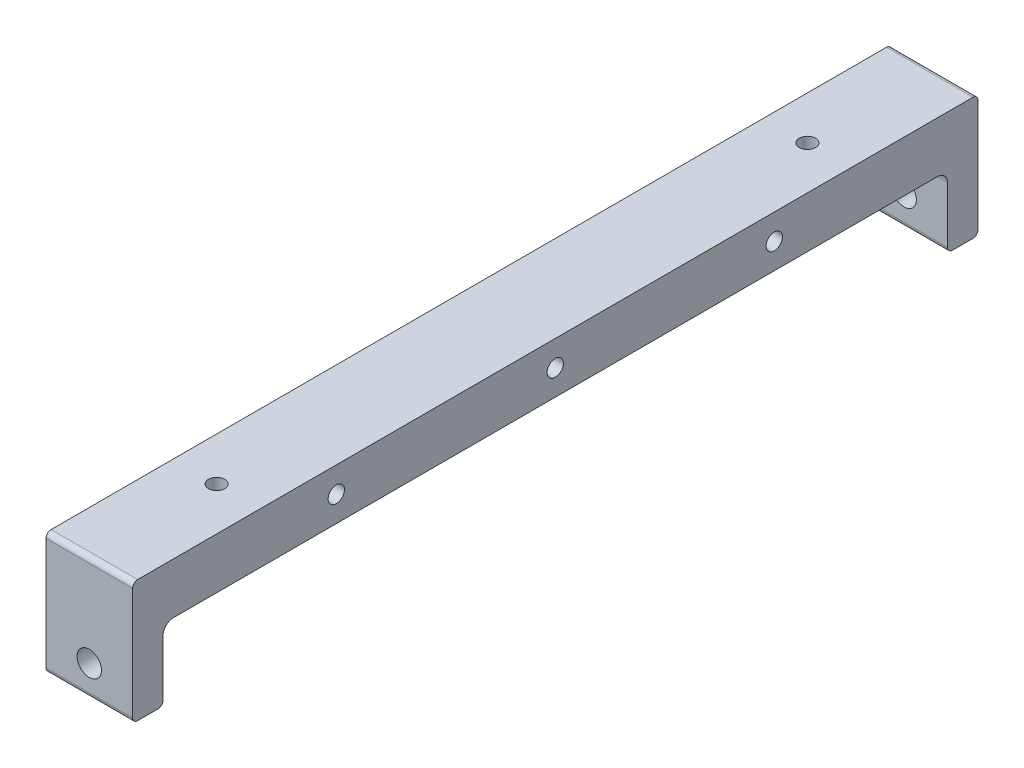
ISO-10303-21;
HEADER;
FILE_DESCRIPTION(('STEP AP214'),'2;1');
FILE_NAME('part.step','',(''),(''),'','','');
FILE_SCHEMA(('AUTOMOTIVE_DESIGN { 1 0 10303 214 1 1 1 1 }'));
ENDSEC;
DATA;
#1=APPLICATION_CONTEXT('core data for automotive mechanical design processes');
#2=APPLICATION_PROTOCOL_DEFINITION('international standard','automotive_design',2000,#1);
#3=PRODUCT_CONTEXT('',#1,'mechanical');
#4=PRODUCT('Part','Part','',(#3));
#5=PRODUCT_RELATED_PRODUCT_CATEGORY('part','',(#4));
#6=PRODUCT_DEFINITION_FORMATION('','',#4);
#7=PRODUCT_DEFINITION_CONTEXT('part definition',#1,'design');
#8=PRODUCT_DEFINITION('design','',#6,#7);
#9=PRODUCT_DEFINITION_SHAPE('','',#8);
#10=(LENGTH_UNIT() NAMED_UNIT(*) SI_UNIT(.MILLI.,.METRE.));
#11=(NAMED_UNIT(*) PLANE_ANGLE_UNIT() SI_UNIT($,.RADIAN.));
#12=(NAMED_UNIT(*) SI_UNIT($,.STERADIAN.) SOLID_ANGLE_UNIT());
#13=UNCERTAINTY_MEASURE_WITH_UNIT(LENGTH_MEASURE(1.E-05),#10,'distance_accuracy_value','');
#14=(GEOMETRIC_REPRESENTATION_CONTEXT(3) GLOBAL_UNCERTAINTY_ASSIGNED_CONTEXT((#13)) GLOBAL_UNIT_ASSIGNED_CONTEXT((#10,
#11,#12)) REPRESENTATION_CONTEXT('',''));
#15=CARTESIAN_POINT('',(0.,0.,0.));
#16=DIRECTION('',(0.,0.,1.));
#17=DIRECTION('',(1.,0.,0.));
#18=AXIS2_PLACEMENT_3D('',#15,#16,#17);
#19=CARTESIAN_POINT('',(-4.25,-6.,41.5));
#20=DIRECTION('',(0.,1.,0.));
#21=DIRECTION('',(0.,0.,1.));
#22=AXIS2_PLACEMENT_3D('',#19,#20,#21);
#23=PLANE('',#22);
#24=DIRECTION('',(0.,0.,-1.));
#25=VECTOR('',#24,1.);
#26=CARTESIAN_POINT('',(-4.25,-6.,41.5));
#27=LINE('',#26,#25);
#28=CARTESIAN_POINT('',(-4.25,-6.,41.));
#29=VERTEX_POINT('',#28);
#30=CARTESIAN_POINT('',(-4.25,-6.,39.));
#31=VERTEX_POINT('',#30);
#32=EDGE_CURVE('E272',#29,#31,#27,.T.);
#33=ORIENTED_EDGE('',*,*,#32,.T.);
#34=DIRECTION('',(1.,0.,0.));
#35=VECTOR('',#34,1.);
#36=CARTESIAN_POINT('',(-4.25,-6.,39.));
#37=LINE('',#36,#35);
#38=CARTESIAN_POINT('',(4.25,-6.,39.));
#39=VERTEX_POINT('',#38);
#40=EDGE_CURVE('E281',#31,#39,#37,.T.);
#41=ORIENTED_EDGE('',*,*,#40,.T.);
#42=DIRECTION('',(0.,0.,-1.));
#43=VECTOR('',#42,1.);
#44=CARTESIAN_POINT('',(4.25,-6.,41.5));
#45=LINE('',#44,#43);
#46=CARTESIAN_POINT('',(4.25,-6.,41.));
#47=VERTEX_POINT('',#46);
#48=EDGE_CURVE('E269',#47,#39,#45,.T.);
#49=ORIENTED_EDGE('',*,*,#48,.F.);
#50=DIRECTION('',(1.,0.,0.));
#51=VECTOR('',#50,1.);
#52=CARTESIAN_POINT('',(-4.25,-6.,41.));
#53=LINE('',#52,#51);
#54=EDGE_CURVE('E279',#47,#29,#53,.F.);
#55=ORIENTED_EDGE('',*,*,#54,.T.);
#56=EDGE_LOOP('',(#33,#41,#49,#55));
#57=FACE_BOUND('',#56,.T.);
#58=ADVANCED_FACE('F33',(#57),#23,.F.);
#59=CARTESIAN_POINT('',(4.25,-6.,41.5));
#60=DIRECTION('',(-1.,0.,0.));
#61=DIRECTION('',(0.,0.,1.));
#62=AXIS2_PLACEMENT_3D('',#59,#60,#61);
#63=PLANE('',#62);
#64=CARTESIAN_POINT('',(4.25,3.5,0.));
#65=DIRECTION('',(1.,0.,0.));
#66=DIRECTION('',(0.,0.,-1.));
#67=AXIS2_PLACEMENT_3D('',#64,#65,#66);
#68=CIRCLE('',#67,0.799999999999999);
#69=CARTESIAN_POINT('',(4.25,3.5,-0.799999999999999));
#70=VERTEX_POINT('',#69);
#71=EDGE_CURVE('E200',#70,#70,#68,.T.);
#72=ORIENTED_EDGE('',*,*,#71,.F.);
#73=EDGE_LOOP('',(#72));
#74=FACE_BOUND('',#73,.T.);
#75=CARTESIAN_POINT('',(4.25,3.5,-21.5));
#76=DIRECTION('',(1.,0.,0.));
#77=DIRECTION('',(0.,0.,-1.));
#78=AXIS2_PLACEMENT_3D('',#75,#76,#77);
#79=CIRCLE('',#78,0.799999999999999);
#80=CARTESIAN_POINT('',(4.25,3.5,-22.3));
#81=VERTEX_POINT('',#80);
#82=EDGE_CURVE('E206',#81,#81,#79,.T.);
#83=ORIENTED_EDGE('',*,*,#82,.F.);
#84=EDGE_LOOP('',(#83));
#85=FACE_BOUND('',#84,.T.);
#86=CARTESIAN_POINT('',(4.25,3.5,21.5));
#87=DIRECTION('',(1.,0.,0.));
#88=DIRECTION('',(0.,0.,-1.));
#89=AXIS2_PLACEMENT_3D('',#86,#87,#88);
#90=CIRCLE('',#89,0.799999999999999);
#91=CARTESIAN_POINT('',(4.25,3.5,20.7));
#92=VERTEX_POINT('',#91);
#93=EDGE_CURVE('E212',#92,#92,#90,.T.);
#94=ORIENTED_EDGE('',*,*,#93,.F.);
#95=EDGE_LOOP('',(#94));
#96=FACE_BOUND('',#95,.T.);
#97=ORIENTED_EDGE('',*,*,#48,.T.);
#98=CARTESIAN_POINT('',(4.25,-5.5,39.));
#99=DIRECTION('',(-1.,0.,0.));
#100=DIRECTION('',(0.,0.,1.));
#101=AXIS2_PLACEMENT_3D('',#98,#99,#100);
#102=CIRCLE('',#101,0.5);
#103=CARTESIAN_POINT('',(4.25,-5.5,38.5));
#104=VERTEX_POINT('',#103);
#105=EDGE_CURVE('E294',#39,#104,#102,.F.);
#106=ORIENTED_EDGE('',*,*,#105,.T.);
#107=DIRECTION('',(0.,-1.,0.));
#108=VECTOR('',#107,1.);
#109=CARTESIAN_POINT('',(4.25,-6.00000000000001,38.5));
#110=LINE('',#109,#108);
#111=CARTESIAN_POINT('',(4.25,0.,38.5));
#112=VERTEX_POINT('',#111);
#113=EDGE_CURVE('E222',#112,#104,#110,.T.);
#114=ORIENTED_EDGE('',*,*,#113,.F.);
#115=CARTESIAN_POINT('',(4.25,0.,37.5));
#116=DIRECTION('',(1.,0.,0.));
#117=DIRECTION('',(0.,0.,-1.));
#118=AXIS2_PLACEMENT_3D('',#115,#116,#117);
#119=CIRCLE('',#118,1.);
#120=CARTESIAN_POINT('',(4.25,1.,37.5));
#121=VERTEX_POINT('',#120);
#122=EDGE_CURVE('E242',#121,#112,#119,.T.);
#123=ORIENTED_EDGE('',*,*,#122,.F.);
#124=DIRECTION('',(0.,0.,1.));
#125=VECTOR('',#124,1.);
#126=CARTESIAN_POINT('',(4.25,1.,37.5));
#127=LINE('',#126,#125);
#128=CARTESIAN_POINT('',(4.25,1.,-37.5));
#129=VERTEX_POINT('',#128);
#130=EDGE_CURVE('E239',#129,#121,#127,.T.);
#131=ORIENTED_EDGE('',*,*,#130,.F.);
#132=CARTESIAN_POINT('',(4.25,0.,-37.5));
#133=DIRECTION('',(1.,0.,0.));
#134=DIRECTION('',(0.,0.,1.));
#135=AXIS2_PLACEMENT_3D('',#132,#133,#134);
#136=CIRCLE('',#135,1.);
#137=CARTESIAN_POINT('',(4.25,0.,-38.5));
#138=VERTEX_POINT('',#137);
#139=EDGE_CURVE('E236',#138,#129,#136,.T.);
#140=ORIENTED_EDGE('',*,*,#139,.F.);
#141=DIRECTION('',(0.,1.,0.));
#142=VECTOR('',#141,1.);
#143=CARTESIAN_POINT('',(4.25,0.,-38.5));
#144=LINE('',#143,#142);
#145=CARTESIAN_POINT('',(4.25,-5.5,-38.5));
#146=VERTEX_POINT('',#145);
#147=EDGE_CURVE('E218',#146,#138,#144,.T.);
#148=ORIENTED_EDGE('',*,*,#147,.F.);
#149=CARTESIAN_POINT('',(4.25,-5.5,-39.));
#150=DIRECTION('',(-1.,0.,0.));
#151=DIRECTION('',(0.,0.,1.));
#152=AXIS2_PLACEMENT_3D('',#149,#150,#151);
#153=CIRCLE('',#152,0.5);
#154=CARTESIAN_POINT('',(4.25,-6.,-39.));
#155=VERTEX_POINT('',#154);
#156=EDGE_CURVE('E290',#146,#155,#153,.F.);
#157=ORIENTED_EDGE('',*,*,#156,.T.);
#158=CARTESIAN_POINT('',(4.25,-6.,-41.));
#159=VERTEX_POINT('',#158);
#160=EDGE_CURVE('E263',#155,#159,#45,.T.);
#161=ORIENTED_EDGE('',*,*,#160,.T.);
#162=CARTESIAN_POINT('',(4.25,-5.5,-41.));
#163=DIRECTION('',(-1.,0.,0.));
#164=DIRECTION('',(0.,0.,1.));
#165=AXIS2_PLACEMENT_3D('',#162,#163,#164);
#166=CIRCLE('',#165,0.5);
#167=CARTESIAN_POINT('',(4.25,-5.5,-41.5));
#168=VERTEX_POINT('',#167);
#169=EDGE_CURVE('E288',#159,#168,#166,.F.);
#170=ORIENTED_EDGE('',*,*,#169,.T.);
#171=DIRECTION('',(0.,1.,0.));
#172=VECTOR('',#171,1.);
#173=CARTESIAN_POINT('',(4.25,-6.,-41.5));
#174=LINE('',#173,#172);
#175=CARTESIAN_POINT('',(4.25,5.5,-41.5));
#176=VERTEX_POINT('',#175);
#177=EDGE_CURVE('E249',#168,#176,#174,.T.);
#178=ORIENTED_EDGE('',*,*,#177,.T.);
#179=CARTESIAN_POINT('',(4.25,5.5,-41.));
#180=DIRECTION('',(-1.,0.,0.));
#181=DIRECTION('',(0.,0.,1.));
#182=AXIS2_PLACEMENT_3D('',#179,#180,#181);
#183=CIRCLE('',#182,0.5);
#184=CARTESIAN_POINT('',(4.25,6.,-41.));
#185=VERTEX_POINT('',#184);
#186=EDGE_CURVE('E284',#176,#185,#183,.F.);
#187=ORIENTED_EDGE('',*,*,#186,.T.);
#188=DIRECTION('',(0.,0.,-1.));
#189=VECTOR('',#188,1.);
#190=CARTESIAN_POINT('',(4.25,6.,41.5));
#191=LINE('',#190,#189);
#192=CARTESIAN_POINT('',(4.25,6.,41.));
#193=VERTEX_POINT('',#192);
#194=EDGE_CURVE('E276',#193,#185,#191,.T.);
#195=ORIENTED_EDGE('',*,*,#194,.F.);
#196=CARTESIAN_POINT('',(4.25,5.5,41.));
#197=DIRECTION('',(-1.,0.,0.));
#198=DIRECTION('',(0.,0.,1.));
#199=AXIS2_PLACEMENT_3D('',#196,#197,#198);
#200=CIRCLE('',#199,0.5);
#201=CARTESIAN_POINT('',(4.25,5.5,41.5));
#202=VERTEX_POINT('',#201);
#203=EDGE_CURVE('E286',#193,#202,#200,.F.);
#204=ORIENTED_EDGE('',*,*,#203,.T.);
#205=DIRECTION('',(0.,1.,0.));
#206=VECTOR('',#205,1.);
#207=CARTESIAN_POINT('',(4.25,-6.,41.5));
#208=LINE('',#207,#206);
#209=CARTESIAN_POINT('',(4.25,-5.5,41.5));
#210=VERTEX_POINT('',#209);
#211=EDGE_CURVE('E256',#210,#202,#208,.T.);
#212=ORIENTED_EDGE('',*,*,#211,.F.);
#213=CARTESIAN_POINT('',(4.25,-5.5,41.));
#214=DIRECTION('',(-1.,0.,0.));
#215=DIRECTION('',(0.,0.,1.));
#216=AXIS2_PLACEMENT_3D('',#213,#214,#215);
#217=CIRCLE('',#216,0.5);
#218=EDGE_CURVE('E292',#210,#47,#217,.F.);
#219=ORIENTED_EDGE('',*,*,#218,.T.);
#220=EDGE_LOOP('',(#97,#106,#114,#123,#131,#140,#148,#157,#161,#170,#178,#187,#195,#204,#212,#219));
#221=FACE_BOUND('',#220,.T.);
#222=ADVANCED_FACE('F348',(#74,#85,#96,#221),#63,.F.);
#223=CARTESIAN_POINT('',(-4.25,6.,41.5));
#224=DIRECTION('',(0.,-1.,0.));
#225=DIRECTION('',(0.,0.,-1.));
#226=AXIS2_PLACEMENT_3D('',#223,#224,#225);
#227=PLANE('',#226);
#228=CARTESIAN_POINT('',(0.,6.,-29.));
#229=DIRECTION('',(0.,1.,0.));
#230=DIRECTION('',(0.,0.,1.));
#231=AXIS2_PLACEMENT_3D('',#228,#229,#230);
#232=CIRCLE('',#231,0.799999999999998);
#233=CARTESIAN_POINT('',(0.,6.,-28.2));
#234=VERTEX_POINT('',#233);
#235=EDGE_CURVE('E182',#234,#234,#232,.T.);
#236=ORIENTED_EDGE('',*,*,#235,.F.);
#237=EDGE_LOOP('',(#236));
#238=FACE_BOUND('',#237,.T.);
#239=CARTESIAN_POINT('',(0.,6.,29.));
#240=DIRECTION('',(0.,1.,0.));
#241=DIRECTION('',(0.,0.,1.));
#242=AXIS2_PLACEMENT_3D('',#239,#240,#241);
#243=CIRCLE('',#242,0.799999999999998);
#244=CARTESIAN_POINT('',(0.,6.,29.8));
#245=VERTEX_POINT('',#244);
#246=EDGE_CURVE('E188',#245,#245,#243,.T.);
#247=ORIENTED_EDGE('',*,*,#246,.F.);
#248=EDGE_LOOP('',(#247));
#249=FACE_BOUND('',#248,.T.);
#250=DIRECTION('',(0.,0.,-1.));
#251=VECTOR('',#250,1.);
#252=CARTESIAN_POINT('',(-4.25,6.,41.5));
#253=LINE('',#252,#251);
#254=CARTESIAN_POINT('',(-4.25,6.,41.));
#255=VERTEX_POINT('',#254);
#256=CARTESIAN_POINT('',(-4.25,6.,-41.));
#257=VERTEX_POINT('',#256);
#258=EDGE_CURVE('E273',#255,#257,#253,.T.);
#259=ORIENTED_EDGE('',*,*,#258,.F.);
#260=DIRECTION('',(-1.,0.,0.));
#261=VECTOR('',#260,1.);
#262=CARTESIAN_POINT('',(-4.25,6.,41.));
#263=LINE('',#262,#261);
#264=EDGE_CURVE('E11',#255,#193,#263,.F.);
#265=ORIENTED_EDGE('',*,*,#264,.T.);
#266=ORIENTED_EDGE('',*,*,#194,.T.);
#267=DIRECTION('',(-1.,0.,0.));
#268=VECTOR('',#267,1.);
#269=CARTESIAN_POINT('',(-4.25,6.,-41.));
#270=LINE('',#269,#268);
#271=EDGE_CURVE('E42',#185,#257,#270,.T.);
#272=ORIENTED_EDGE('',*,*,#271,.T.);
#273=EDGE_LOOP('',(#259,#265,#266,#272));
#274=FACE_BOUND('',#273,.T.);
#275=ADVANCED_FACE('F330',(#238,#249,#274),#227,.F.);
#276=CARTESIAN_POINT('',(-4.25,-6.,41.5));
#277=DIRECTION('',(1.,0.,0.));
#278=DIRECTION('',(0.,0.,-1.));
#279=AXIS2_PLACEMENT_3D('',#276,#277,#278);
#280=PLANE('',#279);
#281=CARTESIAN_POINT('',(-4.25,3.5,-35.5));
#282=DIRECTION('',(-1.,0.,0.));
#283=DIRECTION('',(0.,0.,1.));
#284=AXIS2_PLACEMENT_3D('',#281,#282,#283);
#285=CIRCLE('',#284,0.799999999999999);
#286=CARTESIAN_POINT('',(-4.25,3.5,-34.7));
#287=VERTEX_POINT('',#286);
#288=EDGE_CURVE('E171',#287,#287,#285,.T.);
#289=ORIENTED_EDGE('',*,*,#288,.F.);
#290=EDGE_LOOP('',(#289));
#291=FACE_BOUND('',#290,.T.);
#292=CARTESIAN_POINT('',(-4.25,3.5,35.5));
#293=DIRECTION('',(-1.,0.,0.));
#294=DIRECTION('',(0.,0.,1.));
#295=AXIS2_PLACEMENT_3D('',#292,#293,#294);
#296=CIRCLE('',#295,0.799999999999999);
#297=CARTESIAN_POINT('',(-4.25,3.5,36.3));
#298=VERTEX_POINT('',#297);
#299=EDGE_CURVE('E170',#298,#298,#296,.T.);
#300=ORIENTED_EDGE('',*,*,#299,.F.);
#301=EDGE_LOOP('',(#300));
#302=FACE_BOUND('',#301,.T.);
#303=DIRECTION('',(0.,-1.,0.));
#304=VECTOR('',#303,1.);
#305=CARTESIAN_POINT('',(-4.25,-6.00000000000001,38.5));
#306=LINE('',#305,#304);
#307=CARTESIAN_POINT('',(-4.25,0.,38.5));
#308=VERTEX_POINT('',#307);
#309=CARTESIAN_POINT('',(-4.25,-5.5,38.5));
#310=VERTEX_POINT('',#309);
#311=EDGE_CURVE('E231',#308,#310,#306,.T.);
#312=ORIENTED_EDGE('',*,*,#311,.T.);
#313=CARTESIAN_POINT('',(-4.25,-5.5,39.));
#314=DIRECTION('',(1.,0.,0.));
#315=DIRECTION('',(0.,0.,-1.));
#316=AXIS2_PLACEMENT_3D('',#313,#314,#315);
#317=CIRCLE('',#316,0.5);
#318=EDGE_CURVE('E306',#310,#31,#317,.F.);
#319=ORIENTED_EDGE('',*,*,#318,.T.);
#320=ORIENTED_EDGE('',*,*,#32,.F.);
#321=CARTESIAN_POINT('',(-4.25,-5.5,41.));
#322=DIRECTION('',(1.,0.,0.));
#323=DIRECTION('',(0.,0.,-1.));
#324=AXIS2_PLACEMENT_3D('',#321,#322,#323);
#325=CIRCLE('',#324,0.5);
#326=CARTESIAN_POINT('',(-4.25,-5.5,41.5));
#327=VERTEX_POINT('',#326);
#328=EDGE_CURVE('E304',#29,#327,#325,.F.);
#329=ORIENTED_EDGE('',*,*,#328,.T.);
#330=DIRECTION('',(0.,-1.,0.));
#331=VECTOR('',#330,1.);
#332=CARTESIAN_POINT('',(-4.25,-6.,41.5));
#333=LINE('',#332,#331);
#334=CARTESIAN_POINT('',(-4.25,5.5,41.5));
#335=VERTEX_POINT('',#334);
#336=EDGE_CURVE('E259',#335,#327,#333,.T.);
#337=ORIENTED_EDGE('',*,*,#336,.F.);
#338=CARTESIAN_POINT('',(-4.25,5.5,41.));
#339=DIRECTION('',(1.,0.,0.));
#340=DIRECTION('',(0.,0.,-1.));
#341=AXIS2_PLACEMENT_3D('',#338,#339,#340);
#342=CIRCLE('',#341,0.5);
#343=EDGE_CURVE('E300',#335,#255,#342,.F.);
#344=ORIENTED_EDGE('',*,*,#343,.T.);
#345=ORIENTED_EDGE('',*,*,#258,.T.);
#346=CARTESIAN_POINT('',(-4.25,5.5,-41.));
#347=DIRECTION('',(1.,0.,0.));
#348=DIRECTION('',(0.,0.,-1.));
#349=AXIS2_PLACEMENT_3D('',#346,#347,#348);
#350=CIRCLE('',#349,0.5);
#351=CARTESIAN_POINT('',(-4.25,5.5,-41.5));
#352=VERTEX_POINT('',#351);
#353=EDGE_CURVE('E298',#257,#352,#350,.F.);
#354=ORIENTED_EDGE('',*,*,#353,.T.);
#355=DIRECTION('',(0.,-1.,0.));
#356=VECTOR('',#355,1.);
#357=CARTESIAN_POINT('',(-4.25,-6.,-41.5));
#358=LINE('',#357,#356);
#359=CARTESIAN_POINT('',(-4.25,-5.5,-41.5));
#360=VERTEX_POINT('',#359);
#361=EDGE_CURVE('E260',#352,#360,#358,.T.);
#362=ORIENTED_EDGE('',*,*,#361,.T.);
#363=CARTESIAN_POINT('',(-4.25,-5.5,-41.));
#364=DIRECTION('',(1.,0.,0.));
#365=DIRECTION('',(0.,0.,-1.));
#366=AXIS2_PLACEMENT_3D('',#363,#364,#365);
#367=CIRCLE('',#366,0.5);
#368=CARTESIAN_POINT('',(-4.25,-6.,-41.));
#369=VERTEX_POINT('',#368);
#370=EDGE_CURVE('E55',#360,#369,#367,.F.);
#371=ORIENTED_EDGE('',*,*,#370,.T.);
#372=CARTESIAN_POINT('',(-4.25,-6.,-39.));
#373=VERTEX_POINT('',#372);
#374=EDGE_CURVE('E270',#373,#369,#27,.T.);
#375=ORIENTED_EDGE('',*,*,#374,.F.);
#376=CARTESIAN_POINT('',(-4.25,-5.5,-39.));
#377=DIRECTION('',(1.,0.,0.));
#378=DIRECTION('',(0.,0.,-1.));
#379=AXIS2_PLACEMENT_3D('',#376,#377,#378);
#380=CIRCLE('',#379,0.5);
#381=CARTESIAN_POINT('',(-4.25,-5.5,-38.5));
#382=VERTEX_POINT('',#381);
#383=EDGE_CURVE('E49',#373,#382,#380,.F.);
#384=ORIENTED_EDGE('',*,*,#383,.T.);
#385=DIRECTION('',(0.,1.,0.));
#386=VECTOR('',#385,1.);
#387=CARTESIAN_POINT('',(-4.25,0.,-38.5));
#388=LINE('',#387,#386);
#389=CARTESIAN_POINT('',(-4.25,0.,-38.5));
#390=VERTEX_POINT('',#389);
#391=EDGE_CURVE('E219',#382,#390,#388,.T.);
#392=ORIENTED_EDGE('',*,*,#391,.T.);
#393=CARTESIAN_POINT('',(-4.25,0.,-37.5));
#394=DIRECTION('',(1.,0.,0.));
#395=DIRECTION('',(0.,0.,1.));
#396=AXIS2_PLACEMENT_3D('',#393,#394,#395);
#397=CIRCLE('',#396,1.);
#398=CARTESIAN_POINT('',(-4.25,1.,-37.5));
#399=VERTEX_POINT('',#398);
#400=EDGE_CURVE('E221',#390,#399,#397,.T.);
#401=ORIENTED_EDGE('',*,*,#400,.T.);
#402=DIRECTION('',(0.,0.,1.));
#403=VECTOR('',#402,1.);
#404=CARTESIAN_POINT('',(-4.25,1.,37.5));
#405=LINE('',#404,#403);
#406=CARTESIAN_POINT('',(-4.25,1.,37.5));
#407=VERTEX_POINT('',#406);
#408=EDGE_CURVE('E225',#399,#407,#405,.T.);
#409=ORIENTED_EDGE('',*,*,#408,.T.);
#410=CARTESIAN_POINT('',(-4.25,0.,37.5));
#411=DIRECTION('',(1.,0.,0.));
#412=DIRECTION('',(0.,0.,-1.));
#413=AXIS2_PLACEMENT_3D('',#410,#411,#412);
#414=CIRCLE('',#413,1.);
#415=EDGE_CURVE('E228',#407,#308,#414,.T.);
#416=ORIENTED_EDGE('',*,*,#415,.T.);
#417=EDGE_LOOP('',(#312,#319,#320,#329,#337,#344,#345,#354,#362,#371,#375,#384,#392,#401,#409,#416));
#418=FACE_BOUND('',#417,.T.);
#419=ADVANCED_FACE('F335',(#291,#302,#418),#280,.F.);
#420=ORIENTED_EDGE('',*,*,#160,.F.);
#421=DIRECTION('',(1.,0.,0.));
#422=VECTOR('',#421,1.);
#423=CARTESIAN_POINT('',(-4.25,-6.,-39.));
#424=LINE('',#423,#422);
#425=EDGE_CURVE('E320',#155,#373,#424,.F.);
#426=ORIENTED_EDGE('',*,*,#425,.T.);
#427=ORIENTED_EDGE('',*,*,#374,.T.);
#428=DIRECTION('',(1.,0.,0.));
#429=VECTOR('',#428,1.);
#430=CARTESIAN_POINT('',(4.25,-6.,-41.));
#431=LINE('',#430,#429);
#432=EDGE_CURVE('E317',#369,#159,#431,.T.);
#433=ORIENTED_EDGE('',*,*,#432,.T.);
#434=EDGE_LOOP('',(#420,#426,#427,#433));
#435=FACE_BOUND('',#434,.T.);
#436=ADVANCED_FACE('F360',(#435),#23,.F.);
#437=CARTESIAN_POINT('',(0.,0.,41.5));
#438=DIRECTION('',(0.,0.,-1.));
#439=DIRECTION('',(-1.,0.,0.));
#440=AXIS2_PLACEMENT_3D('',#437,#438,#439);
#441=PLANE('',#440);
#442=CARTESIAN_POINT('',(0.,-3.,41.5));
#443=DIRECTION('',(0.,0.,1.));
#444=DIRECTION('',(1.,0.,0.));
#445=AXIS2_PLACEMENT_3D('',#442,#443,#444);
#446=CIRCLE('',#445,1.19999999999998);
#447=CARTESIAN_POINT('',(1.19999999999998,-3.,41.5));
#448=VERTEX_POINT('',#447);
#449=EDGE_CURVE('E194',#448,#448,#446,.T.);
#450=ORIENTED_EDGE('',*,*,#449,.F.);
#451=EDGE_LOOP('',(#450));
#452=FACE_BOUND('',#451,.T.);
#453=ORIENTED_EDGE('',*,*,#336,.T.);
#454=DIRECTION('',(1.,0.,0.));
#455=VECTOR('',#454,1.);
#456=CARTESIAN_POINT('',(0.,-5.5,41.5));
#457=LINE('',#456,#455);
#458=EDGE_CURVE('E311',#327,#210,#457,.T.);
#459=ORIENTED_EDGE('',*,*,#458,.T.);
#460=ORIENTED_EDGE('',*,*,#211,.T.);
#461=DIRECTION('',(-1.,0.,0.));
#462=VECTOR('',#461,1.);
#463=CARTESIAN_POINT('',(0.,5.5,41.5));
#464=LINE('',#463,#462);
#465=EDGE_CURVE('E308',#202,#335,#464,.T.);
#466=ORIENTED_EDGE('',*,*,#465,.T.);
#467=EDGE_LOOP('',(#453,#459,#460,#466));
#468=FACE_BOUND('',#467,.T.);
#469=ADVANCED_FACE('F343',(#452,#468),#441,.F.);
#470=CARTESIAN_POINT('',(0.,0.,-41.5));
#471=DIRECTION('',(0.,0.,-1.));
#472=DIRECTION('',(-1.,0.,0.));
#473=AXIS2_PLACEMENT_3D('',#470,#471,#472);
#474=PLANE('',#473);
#475=CARTESIAN_POINT('',(0.,-3.,-41.5));
#476=DIRECTION('',(0.,0.,-1.));
#477=DIRECTION('',(-1.,0.,0.));
#478=AXIS2_PLACEMENT_3D('',#475,#476,#477);
#479=CIRCLE('',#478,1.19999999999999);
#480=CARTESIAN_POINT('',(-1.19999999999999,-3.,-41.5));
#481=VERTEX_POINT('',#480);
#482=EDGE_CURVE('E505',#481,#481,#479,.T.);
#483=ORIENTED_EDGE('',*,*,#482,.F.);
#484=EDGE_LOOP('',(#483));
#485=FACE_BOUND('',#484,.T.);
#486=ORIENTED_EDGE('',*,*,#177,.F.);
#487=DIRECTION('',(1.,0.,0.));
#488=VECTOR('',#487,1.);
#489=CARTESIAN_POINT('',(-4.25,-5.5,-41.5));
#490=LINE('',#489,#488);
#491=EDGE_CURVE('E324',#168,#360,#490,.F.);
#492=ORIENTED_EDGE('',*,*,#491,.T.);
#493=ORIENTED_EDGE('',*,*,#361,.F.);
#494=DIRECTION('',(-1.,0.,0.));
#495=VECTOR('',#494,1.);
#496=CARTESIAN_POINT('',(4.25,5.5,-41.5));
#497=LINE('',#496,#495);
#498=EDGE_CURVE('E322',#352,#176,#497,.F.);
#499=ORIENTED_EDGE('',*,*,#498,.T.);
#500=EDGE_LOOP('',(#486,#492,#493,#499));
#501=FACE_BOUND('',#500,.T.);
#502=ADVANCED_FACE('F353',(#485,#501),#474,.T.);
#503=CARTESIAN_POINT('',(-4.25,-6.00000000000001,38.5));
#504=DIRECTION('',(0.,0.,1.));
#505=DIRECTION('',(1.,0.,0.));
#506=AXIS2_PLACEMENT_3D('',#503,#504,#505);
#507=PLANE('',#506);
#508=CARTESIAN_POINT('',(0.,-3.,38.5));
#509=DIRECTION('',(0.,0.,1.));
#510=DIRECTION('',(1.,0.,0.));
#511=AXIS2_PLACEMENT_3D('',#508,#509,#510);
#512=CIRCLE('',#511,1.19999999999997);
#513=CARTESIAN_POINT('',(1.19999999999997,-3.,38.5));
#514=VERTEX_POINT('',#513);
#515=EDGE_CURVE('E197',#514,#514,#512,.T.);
#516=ORIENTED_EDGE('',*,*,#515,.T.);
#517=EDGE_LOOP('',(#516));
#518=FACE_BOUND('',#517,.T.);
#519=ORIENTED_EDGE('',*,*,#113,.T.);
#520=DIRECTION('',(1.,0.,0.));
#521=VECTOR('',#520,1.);
#522=CARTESIAN_POINT('',(-4.25,-5.5,38.5));
#523=LINE('',#522,#521);
#524=EDGE_CURVE('E296',#104,#310,#523,.F.);
#525=ORIENTED_EDGE('',*,*,#524,.T.);
#526=ORIENTED_EDGE('',*,*,#311,.F.);
#527=DIRECTION('',(1.,0.,0.));
#528=VECTOR('',#527,1.);
#529=CARTESIAN_POINT('',(-4.25,0.,38.5));
#530=LINE('',#529,#528);
#531=EDGE_CURVE('E247',#308,#112,#530,.T.);
#532=ORIENTED_EDGE('',*,*,#531,.T.);
#533=EDGE_LOOP('',(#519,#525,#526,#532));
#534=FACE_BOUND('',#533,.T.);
#535=ADVANCED_FACE('F393',(#518,#534),#507,.F.);
#536=CARTESIAN_POINT('',(-4.25,0.,37.5));
#537=DIRECTION('',(1.,0.,0.));
#538=DIRECTION('',(0.,0.,-1.));
#539=AXIS2_PLACEMENT_3D('',#536,#537,#538);
#540=CYLINDRICAL_SURFACE('',#539,1.);
#541=ORIENTED_EDGE('',*,*,#122,.T.);
#542=ORIENTED_EDGE('',*,*,#531,.F.);
#543=ORIENTED_EDGE('',*,*,#415,.F.);
#544=DIRECTION('',(1.,0.,0.));
#545=VECTOR('',#544,1.);
#546=CARTESIAN_POINT('',(-4.25,1.,37.5));
#547=LINE('',#546,#545);
#548=EDGE_CURVE('E250',#407,#121,#547,.T.);
#549=ORIENTED_EDGE('',*,*,#548,.T.);
#550=EDGE_LOOP('',(#541,#542,#543,#549));
#551=FACE_BOUND('',#550,.T.);
#552=ADVANCED_FACE('F380',(#551),#540,.F.);
#553=CARTESIAN_POINT('',(-4.25,1.,37.5));
#554=DIRECTION('',(0.,1.,0.));
#555=DIRECTION('',(0.,0.,1.));
#556=AXIS2_PLACEMENT_3D('',#553,#554,#555);
#557=PLANE('',#556);
#558=CARTESIAN_POINT('',(0.,1.,-29.));
#559=DIRECTION('',(0.,1.,0.));
#560=DIRECTION('',(0.,0.,1.));
#561=AXIS2_PLACEMENT_3D('',#558,#559,#560);
#562=CIRCLE('',#561,0.799999999999998);
#563=CARTESIAN_POINT('',(0.,1.,-28.2));
#564=VERTEX_POINT('',#563);
#565=EDGE_CURVE('E185',#564,#564,#562,.T.);
#566=ORIENTED_EDGE('',*,*,#565,.T.);
#567=EDGE_LOOP('',(#566));
#568=FACE_BOUND('',#567,.T.);
#569=CARTESIAN_POINT('',(0.,1.,29.));
#570=DIRECTION('',(0.,1.,0.));
#571=DIRECTION('',(0.,0.,1.));
#572=AXIS2_PLACEMENT_3D('',#569,#570,#571);
#573=CIRCLE('',#572,0.799999999999998);
#574=CARTESIAN_POINT('',(0.,1.,29.8));
#575=VERTEX_POINT('',#574);
#576=EDGE_CURVE('E191',#575,#575,#573,.T.);
#577=ORIENTED_EDGE('',*,*,#576,.T.);
#578=EDGE_LOOP('',(#577));
#579=FACE_BOUND('',#578,.T.);
#580=ORIENTED_EDGE('',*,*,#130,.T.);
#581=ORIENTED_EDGE('',*,*,#548,.F.);
#582=ORIENTED_EDGE('',*,*,#408,.F.);
#583=DIRECTION('',(1.,0.,0.));
#584=VECTOR('',#583,1.);
#585=CARTESIAN_POINT('',(-4.25,1.,-37.5));
#586=LINE('',#585,#584);
#587=EDGE_CURVE('E252',#399,#129,#586,.T.);
#588=ORIENTED_EDGE('',*,*,#587,.T.);
#589=EDGE_LOOP('',(#580,#581,#582,#588));
#590=FACE_BOUND('',#589,.T.);
#591=ADVANCED_FACE('F376',(#568,#579,#590),#557,.F.);
#592=CARTESIAN_POINT('',(-4.25,0.,-37.5));
#593=DIRECTION('',(1.,0.,0.));
#594=DIRECTION('',(0.,0.,-1.));
#595=AXIS2_PLACEMENT_3D('',#592,#593,#594);
#596=CYLINDRICAL_SURFACE('',#595,1.);
#597=ORIENTED_EDGE('',*,*,#139,.T.);
#598=ORIENTED_EDGE('',*,*,#587,.F.);
#599=ORIENTED_EDGE('',*,*,#400,.F.);
#600=DIRECTION('',(1.,0.,0.));
#601=VECTOR('',#600,1.);
#602=CARTESIAN_POINT('',(-4.25,0.,-38.5));
#603=LINE('',#602,#601);
#604=EDGE_CURVE('E234',#390,#138,#603,.T.);
#605=ORIENTED_EDGE('',*,*,#604,.T.);
#606=EDGE_LOOP('',(#597,#598,#599,#605));
#607=FACE_BOUND('',#606,.T.);
#608=ADVANCED_FACE('F373',(#607),#596,.F.);
#609=CARTESIAN_POINT('',(-4.25,0.,-38.5));
#610=DIRECTION('',(0.,0.,-1.));
#611=DIRECTION('',(-1.,0.,0.));
#612=AXIS2_PLACEMENT_3D('',#609,#610,#611);
#613=PLANE('',#612);
#614=CARTESIAN_POINT('',(0.,-3.,-38.5));
#615=DIRECTION('',(0.,0.,-1.));
#616=DIRECTION('',(-1.,0.,0.));
#617=AXIS2_PLACEMENT_3D('',#614,#615,#616);
#618=CIRCLE('',#617,1.19999999999999);
#619=CARTESIAN_POINT('',(-1.19999999999999,-3.,-38.5));
#620=VERTEX_POINT('',#619);
#621=EDGE_CURVE('E37',#620,#620,#618,.T.);
#622=ORIENTED_EDGE('',*,*,#621,.T.);
#623=EDGE_LOOP('',(#622));
#624=FACE_BOUND('',#623,.T.);
#625=ORIENTED_EDGE('',*,*,#391,.F.);
#626=DIRECTION('',(1.,0.,0.));
#627=VECTOR('',#626,1.);
#628=CARTESIAN_POINT('',(-4.25,-5.5,-38.5));
#629=LINE('',#628,#627);
#630=EDGE_CURVE('E314',#382,#146,#629,.T.);
#631=ORIENTED_EDGE('',*,*,#630,.T.);
#632=ORIENTED_EDGE('',*,*,#147,.T.);
#633=ORIENTED_EDGE('',*,*,#604,.F.);
#634=EDGE_LOOP('',(#625,#631,#632,#633));
#635=FACE_BOUND('',#634,.T.);
#636=ADVANCED_FACE('F368',(#624,#635),#613,.F.);
#637=CARTESIAN_POINT('',(-4.25,-5.5,39.));
#638=DIRECTION('',(1.,0.,0.));
#639=DIRECTION('',(0.,0.,-1.));
#640=AXIS2_PLACEMENT_3D('',#637,#638,#639);
#641=CYLINDRICAL_SURFACE('',#640,0.5);
#642=ORIENTED_EDGE('',*,*,#318,.F.);
#643=ORIENTED_EDGE('',*,*,#524,.F.);
#644=ORIENTED_EDGE('',*,*,#105,.F.);
#645=ORIENTED_EDGE('',*,*,#40,.F.);
#646=EDGE_LOOP('',(#642,#643,#644,#645));
#647=FACE_BOUND('',#646,.T.);
#648=ADVANCED_FACE('F389',(#647),#641,.T.);
#649=CARTESIAN_POINT('',(0.,-5.5,41.));
#650=DIRECTION('',(1.,0.,0.));
#651=DIRECTION('',(0.,0.,-1.));
#652=AXIS2_PLACEMENT_3D('',#649,#650,#651);
#653=CYLINDRICAL_SURFACE('',#652,0.5);
#654=ORIENTED_EDGE('',*,*,#328,.F.);
#655=ORIENTED_EDGE('',*,*,#54,.F.);
#656=ORIENTED_EDGE('',*,*,#218,.F.);
#657=ORIENTED_EDGE('',*,*,#458,.F.);
#658=EDGE_LOOP('',(#654,#655,#656,#657));
#659=FACE_BOUND('',#658,.T.);
#660=ADVANCED_FACE('F436',(#659),#653,.T.);
#661=CARTESIAN_POINT('',(-4.25,-5.5,-39.));
#662=DIRECTION('',(1.,0.,0.));
#663=DIRECTION('',(0.,0.,-1.));
#664=AXIS2_PLACEMENT_3D('',#661,#662,#663);
#665=CYLINDRICAL_SURFACE('',#664,0.5);
#666=ORIENTED_EDGE('',*,*,#383,.F.);
#667=ORIENTED_EDGE('',*,*,#425,.F.);
#668=ORIENTED_EDGE('',*,*,#156,.F.);
#669=ORIENTED_EDGE('',*,*,#630,.F.);
#670=EDGE_LOOP('',(#666,#667,#668,#669));
#671=FACE_BOUND('',#670,.T.);
#672=ADVANCED_FACE('F366',(#671),#665,.T.);
#673=CARTESIAN_POINT('',(-4.25,-5.5,-41.));
#674=DIRECTION('',(-1.,0.,0.));
#675=DIRECTION('',(0.,0.,1.));
#676=AXIS2_PLACEMENT_3D('',#673,#674,#675);
#677=CYLINDRICAL_SURFACE('',#676,0.5);
#678=ORIENTED_EDGE('',*,*,#370,.F.);
#679=ORIENTED_EDGE('',*,*,#491,.F.);
#680=ORIENTED_EDGE('',*,*,#169,.F.);
#681=ORIENTED_EDGE('',*,*,#432,.F.);
#682=EDGE_LOOP('',(#678,#679,#680,#681));
#683=FACE_BOUND('',#682,.T.);
#684=ADVANCED_FACE('F357',(#683),#677,.T.);
#685=CARTESIAN_POINT('',(0.,5.5,41.));
#686=DIRECTION('',(-1.,0.,0.));
#687=DIRECTION('',(0.,0.,1.));
#688=AXIS2_PLACEMENT_3D('',#685,#686,#687);
#689=CYLINDRICAL_SURFACE('',#688,0.5);
#690=ORIENTED_EDGE('',*,*,#203,.F.);
#691=ORIENTED_EDGE('',*,*,#264,.F.);
#692=ORIENTED_EDGE('',*,*,#343,.F.);
#693=ORIENTED_EDGE('',*,*,#465,.F.);
#694=EDGE_LOOP('',(#690,#691,#692,#693));
#695=FACE_BOUND('',#694,.T.);
#696=ADVANCED_FACE('F341',(#695),#689,.T.);
#697=CARTESIAN_POINT('',(-4.25,5.5,-41.));
#698=DIRECTION('',(1.,0.,0.));
#699=DIRECTION('',(0.,0.,-1.));
#700=AXIS2_PLACEMENT_3D('',#697,#698,#699);
#701=CYLINDRICAL_SURFACE('',#700,0.5);
#702=ORIENTED_EDGE('',*,*,#186,.F.);
#703=ORIENTED_EDGE('',*,*,#498,.F.);
#704=ORIENTED_EDGE('',*,*,#353,.F.);
#705=ORIENTED_EDGE('',*,*,#271,.F.);
#706=EDGE_LOOP('',(#702,#703,#704,#705));
#707=FACE_BOUND('',#706,.T.);
#708=ADVANCED_FACE('F35',(#707),#701,.T.);
#709=CARTESIAN_POINT('',(-0.750000000000001,3.5,21.5));
#710=DIRECTION('',(1.,0.,0.));
#711=DIRECTION('',(0.,0.,-1.));
#712=AXIS2_PLACEMENT_3D('',#709,#710,#711);
#713=CONICAL_SURFACE('',#712,0.799999999999999,1.02974425867665);
#714=CARTESIAN_POINT('',(-1.23068849522205,3.5,21.5));
#715=VERTEX_POINT('',#714);
#716=VERTEX_LOOP('',#715);
#717=FACE_BOUND('',#716,.T.);
#718=CARTESIAN_POINT('',(-0.750000000000001,3.5,21.5));
#719=DIRECTION('',(1.,0.,0.));
#720=DIRECTION('',(0.,0.,-1.));
#721=AXIS2_PLACEMENT_3D('',#718,#719,#720);
#722=CIRCLE('',#721,0.799999999999999);
#723=CARTESIAN_POINT('',(-0.750000000000001,3.5,20.7));
#724=VERTEX_POINT('',#723);
#725=EDGE_CURVE('E215',#724,#724,#722,.T.);
#726=ORIENTED_EDGE('',*,*,#725,.T.);
#727=EDGE_LOOP('',(#726));
#728=FACE_BOUND('',#727,.T.);
#729=ADVANCED_FACE('F447',(#717,#728),#713,.F.);
#730=CARTESIAN_POINT('',(4.25,3.5,21.5));
#731=DIRECTION('',(1.,0.,0.));
#732=DIRECTION('',(0.,0.,-1.));
#733=AXIS2_PLACEMENT_3D('',#730,#731,#732);
#734=CYLINDRICAL_SURFACE('',#733,0.799999999999999);
#735=ORIENTED_EDGE('',*,*,#725,.F.);
#736=EDGE_LOOP('',(#735));
#737=FACE_BOUND('',#736,.T.);
#738=ORIENTED_EDGE('',*,*,#93,.T.);
#739=EDGE_LOOP('',(#738));
#740=FACE_BOUND('',#739,.T.);
#741=ADVANCED_FACE('F451',(#737,#740),#734,.F.);
#742=CARTESIAN_POINT('',(-0.750000000000001,3.5,-21.5));
#743=DIRECTION('',(1.,0.,0.));
#744=DIRECTION('',(0.,0.,-1.));
#745=AXIS2_PLACEMENT_3D('',#742,#743,#744);
#746=CONICAL_SURFACE('',#745,0.799999999999999,1.02974425867665);
#747=CARTESIAN_POINT('',(-1.23068849522205,3.5,-21.5));
#748=VERTEX_POINT('',#747);
#749=VERTEX_LOOP('',#748);
#750=FACE_BOUND('',#749,.T.);
#751=CARTESIAN_POINT('',(-0.750000000000001,3.5,-21.5));
#752=DIRECTION('',(1.,0.,0.));
#753=DIRECTION('',(0.,0.,-1.));
#754=AXIS2_PLACEMENT_3D('',#751,#752,#753);
#755=CIRCLE('',#754,0.799999999999999);
#756=CARTESIAN_POINT('',(-0.750000000000001,3.5,-22.3));
#757=VERTEX_POINT('',#756);
#758=EDGE_CURVE('E209',#757,#757,#755,.T.);
#759=ORIENTED_EDGE('',*,*,#758,.T.);
#760=EDGE_LOOP('',(#759));
#761=FACE_BOUND('',#760,.T.);
#762=ADVANCED_FACE('F456',(#750,#761),#746,.F.);
#763=CARTESIAN_POINT('',(4.25,3.5,-21.5));
#764=DIRECTION('',(1.,0.,0.));
#765=DIRECTION('',(0.,0.,-1.));
#766=AXIS2_PLACEMENT_3D('',#763,#764,#765);
#767=CYLINDRICAL_SURFACE('',#766,0.799999999999999);
#768=ORIENTED_EDGE('',*,*,#758,.F.);
#769=EDGE_LOOP('',(#768));
#770=FACE_BOUND('',#769,.T.);
#771=ORIENTED_EDGE('',*,*,#82,.T.);
#772=EDGE_LOOP('',(#771));
#773=FACE_BOUND('',#772,.T.);
#774=ADVANCED_FACE('F463',(#770,#773),#767,.F.);
#775=CARTESIAN_POINT('',(0.249999999999999,3.5,0.));
#776=DIRECTION('',(1.,0.,0.));
#777=DIRECTION('',(0.,0.,-1.));
#778=AXIS2_PLACEMENT_3D('',#775,#776,#777);
#779=CONICAL_SURFACE('',#778,0.799999999999999,1.02974425867665);
#780=CARTESIAN_POINT('',(-0.23068849522205,3.5,0.));
#781=VERTEX_POINT('',#780);
#782=VERTEX_LOOP('',#781);
#783=FACE_BOUND('',#782,.T.);
#784=CARTESIAN_POINT('',(0.249999999999999,3.5,0.));
#785=DIRECTION('',(1.,0.,0.));
#786=DIRECTION('',(0.,0.,-1.));
#787=AXIS2_PLACEMENT_3D('',#784,#785,#786);
#788=CIRCLE('',#787,0.799999999999999);
#789=CARTESIAN_POINT('',(0.249999999999999,3.5,-0.799999999999999));
#790=VERTEX_POINT('',#789);
#791=EDGE_CURVE('E203',#790,#790,#788,.T.);
#792=ORIENTED_EDGE('',*,*,#791,.T.);
#793=EDGE_LOOP('',(#792));
#794=FACE_BOUND('',#793,.T.);
#795=ADVANCED_FACE('F467',(#783,#794),#779,.F.);
#796=CARTESIAN_POINT('',(4.25,3.5,0.));
#797=DIRECTION('',(1.,0.,0.));
#798=DIRECTION('',(0.,0.,-1.));
#799=AXIS2_PLACEMENT_3D('',#796,#797,#798);
#800=CYLINDRICAL_SURFACE('',#799,0.799999999999999);
#801=ORIENTED_EDGE('',*,*,#791,.F.);
#802=EDGE_LOOP('',(#801));
#803=FACE_BOUND('',#802,.T.);
#804=ORIENTED_EDGE('',*,*,#71,.T.);
#805=EDGE_LOOP('',(#804));
#806=FACE_BOUND('',#805,.T.);
#807=ADVANCED_FACE('F471',(#803,#806),#800,.F.);
#808=CARTESIAN_POINT('',(0.,-3.,41.5));
#809=DIRECTION('',(0.,0.,1.));
#810=DIRECTION('',(1.,0.,0.));
#811=AXIS2_PLACEMENT_3D('',#808,#809,#810);
#812=CYLINDRICAL_SURFACE('',#811,1.19999999999997);
#813=ORIENTED_EDGE('',*,*,#449,.T.);
#814=EDGE_LOOP('',(#813));
#815=FACE_BOUND('',#814,.T.);
#816=ORIENTED_EDGE('',*,*,#515,.F.);
#817=EDGE_LOOP('',(#816));
#818=FACE_BOUND('',#817,.T.);
#819=ADVANCED_FACE('F475',(#815,#818),#812,.F.);
#820=CARTESIAN_POINT('',(0.,6.,29.));
#821=DIRECTION('',(0.,1.,0.));
#822=DIRECTION('',(0.,0.,1.));
#823=AXIS2_PLACEMENT_3D('',#820,#821,#822);
#824=CYLINDRICAL_SURFACE('',#823,0.799999999999998);
#825=ORIENTED_EDGE('',*,*,#246,.T.);
#826=EDGE_LOOP('',(#825));
#827=FACE_BOUND('',#826,.T.);
#828=ORIENTED_EDGE('',*,*,#576,.F.);
#829=EDGE_LOOP('',(#828));
#830=FACE_BOUND('',#829,.T.);
#831=ADVANCED_FACE('F479',(#827,#830),#824,.F.);
#832=CARTESIAN_POINT('',(0.,6.,-29.));
#833=DIRECTION('',(0.,1.,0.));
#834=DIRECTION('',(0.,0.,1.));
#835=AXIS2_PLACEMENT_3D('',#832,#833,#834);
#836=CYLINDRICAL_SURFACE('',#835,0.799999999999998);
#837=ORIENTED_EDGE('',*,*,#235,.T.);
#838=EDGE_LOOP('',(#837));
#839=FACE_BOUND('',#838,.T.);
#840=ORIENTED_EDGE('',*,*,#565,.F.);
#841=EDGE_LOOP('',(#840));
#842=FACE_BOUND('',#841,.T.);
#843=ADVANCED_FACE('F483',(#839,#842),#836,.F.);
#844=CARTESIAN_POINT('',(0.749999999999999,3.5,35.5));
#845=DIRECTION('',(-1.,0.,0.));
#846=DIRECTION('',(0.,0.,1.));
#847=AXIS2_PLACEMENT_3D('',#844,#845,#846);
#848=CONICAL_SURFACE('',#847,0.799999999999999,1.02974425867665);
#849=CARTESIAN_POINT('',(1.23068849522205,3.5,35.5));
#850=VERTEX_POINT('',#849);
#851=VERTEX_LOOP('',#850);
#852=FACE_BOUND('',#851,.T.);
#853=CARTESIAN_POINT('',(0.749999999999999,3.5,35.5));
#854=DIRECTION('',(-1.,0.,0.));
#855=DIRECTION('',(0.,0.,1.));
#856=AXIS2_PLACEMENT_3D('',#853,#854,#855);
#857=CIRCLE('',#856,0.799999999999999);
#858=CARTESIAN_POINT('',(0.749999999999999,3.5,36.3));
#859=VERTEX_POINT('',#858);
#860=EDGE_CURVE('E174',#859,#859,#857,.T.);
#861=ORIENTED_EDGE('',*,*,#860,.T.);
#862=EDGE_LOOP('',(#861));
#863=FACE_BOUND('',#862,.T.);
#864=ADVANCED_FACE('F487',(#852,#863),#848,.F.);
#865=CARTESIAN_POINT('',(-4.25,3.5,35.5));
#866=DIRECTION('',(-1.,0.,0.));
#867=DIRECTION('',(0.,0.,1.));
#868=AXIS2_PLACEMENT_3D('',#865,#866,#867);
#869=CYLINDRICAL_SURFACE('',#868,0.799999999999999);
#870=ORIENTED_EDGE('',*,*,#860,.F.);
#871=EDGE_LOOP('',(#870));
#872=FACE_BOUND('',#871,.T.);
#873=ORIENTED_EDGE('',*,*,#299,.T.);
#874=EDGE_LOOP('',(#873));
#875=FACE_BOUND('',#874,.T.);
#876=ADVANCED_FACE('F164',(#872,#875),#869,.F.);
#877=CARTESIAN_POINT('',(0.749999999999999,3.5,-35.5));
#878=DIRECTION('',(-1.,0.,0.));
#879=DIRECTION('',(0.,0.,1.));
#880=AXIS2_PLACEMENT_3D('',#877,#878,#879);
#881=CONICAL_SURFACE('',#880,0.799999999999999,1.02974425867665);
#882=CARTESIAN_POINT('',(1.23068849522205,3.5,-35.5));
#883=VERTEX_POINT('',#882);
#884=VERTEX_LOOP('',#883);
#885=FACE_BOUND('',#884,.T.);
#886=CARTESIAN_POINT('',(0.749999999999999,3.5,-35.5));
#887=DIRECTION('',(-1.,0.,0.));
#888=DIRECTION('',(0.,0.,1.));
#889=AXIS2_PLACEMENT_3D('',#886,#887,#888);
#890=CIRCLE('',#889,0.799999999999999);
#891=CARTESIAN_POINT('',(0.749999999999999,3.5,-34.7));
#892=VERTEX_POINT('',#891);
#893=EDGE_CURVE('E168',#892,#892,#890,.T.);
#894=ORIENTED_EDGE('',*,*,#893,.T.);
#895=EDGE_LOOP('',(#894));
#896=FACE_BOUND('',#895,.T.);
#897=ADVANCED_FACE('F160',(#885,#896),#881,.F.);
#898=CARTESIAN_POINT('',(-4.25,3.5,-35.5));
#899=DIRECTION('',(-1.,0.,0.));
#900=DIRECTION('',(0.,0.,1.));
#901=AXIS2_PLACEMENT_3D('',#898,#899,#900);
#902=CYLINDRICAL_SURFACE('',#901,0.799999999999999);
#903=ORIENTED_EDGE('',*,*,#893,.F.);
#904=EDGE_LOOP('',(#903));
#905=FACE_BOUND('',#904,.T.);
#906=ORIENTED_EDGE('',*,*,#288,.T.);
#907=EDGE_LOOP('',(#906));
#908=FACE_BOUND('',#907,.T.);
#909=ADVANCED_FACE('F163',(#905,#908),#902,.F.);
#910=CARTESIAN_POINT('',(0.,-3.,-41.5));
#911=DIRECTION('',(0.,0.,-1.));
#912=DIRECTION('',(-1.,0.,0.));
#913=AXIS2_PLACEMENT_3D('',#910,#911,#912);
#914=CYLINDRICAL_SURFACE('',#913,1.19999999999999);
#915=ORIENTED_EDGE('',*,*,#482,.T.);
#916=EDGE_LOOP('',(#915));
#917=FACE_BOUND('',#916,.T.);
#918=ORIENTED_EDGE('',*,*,#621,.F.);
#919=EDGE_LOOP('',(#918));
#920=FACE_BOUND('',#919,.T.);
#921=ADVANCED_FACE('F497',(#917,#920),#914,.F.);
#922=CLOSED_SHELL('',(#58,#222,#275,#419,#436,#469,#502,#535,#552,#591,#608,#636,#648,#660,#672,
#684,#696,#708,#729,#741,#762,#774,#795,#807,#819,#831,#843,#864,#876,#897,#909,#921));
#923=MANIFOLD_SOLID_BREP('B2',#922);
#924=ADVANCED_BREP_SHAPE_REPRESENTATION('',(#18,#923),#14);
#925=SHAPE_DEFINITION_REPRESENTATION(#9,#924);
ENDSEC;
END-ISO-10303-21;
